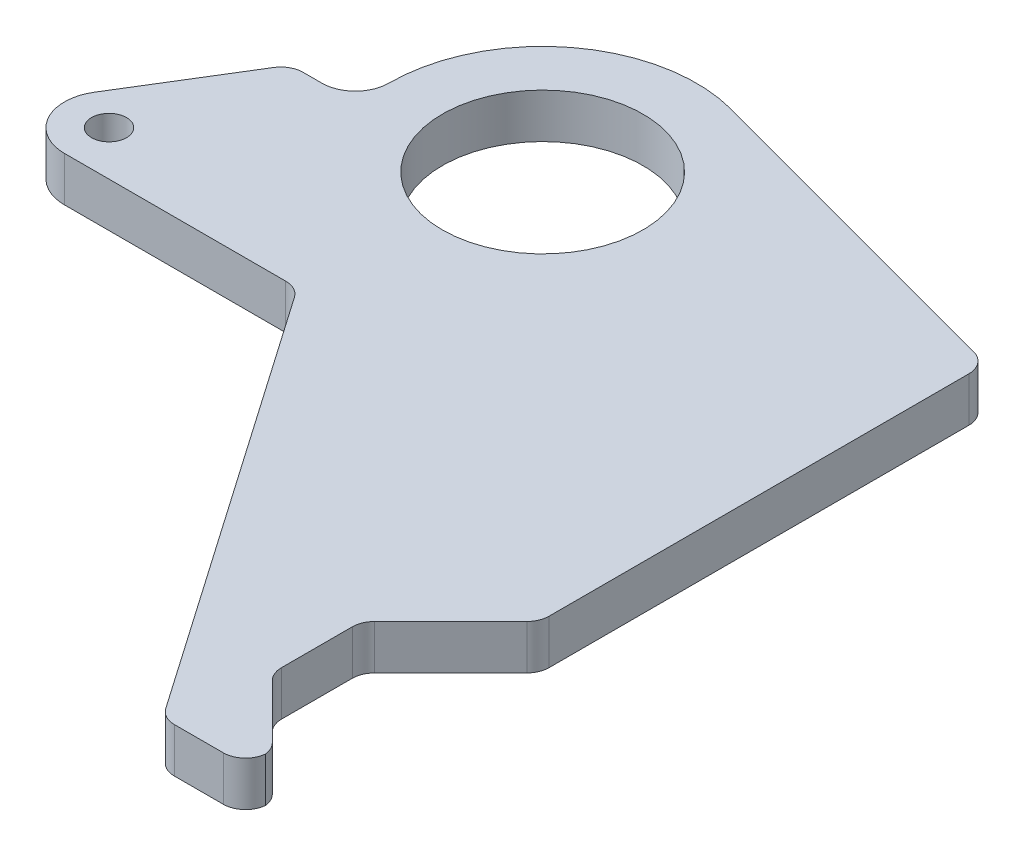
ISO-10303-21;
HEADER;
FILE_DESCRIPTION(('STEP AP214'),'2;1');
FILE_NAME('part.step','',(''),(''),'','','');
FILE_SCHEMA(('AUTOMOTIVE_DESIGN { 1 0 10303 214 1 1 1 1 }'));
ENDSEC;
DATA;
#1=APPLICATION_CONTEXT('core data for automotive mechanical design processes');
#2=APPLICATION_PROTOCOL_DEFINITION('international standard','automotive_design',2000,#1);
#3=PRODUCT_CONTEXT('',#1,'mechanical');
#4=PRODUCT('Part','Part','',(#3));
#5=PRODUCT_RELATED_PRODUCT_CATEGORY('part','',(#4));
#6=PRODUCT_DEFINITION_FORMATION('','',#4);
#7=PRODUCT_DEFINITION_CONTEXT('part definition',#1,'design');
#8=PRODUCT_DEFINITION('design','',#6,#7);
#9=PRODUCT_DEFINITION_SHAPE('','',#8);
#10=(LENGTH_UNIT() NAMED_UNIT(*) SI_UNIT(.MILLI.,.METRE.));
#11=(NAMED_UNIT(*) PLANE_ANGLE_UNIT() SI_UNIT($,.RADIAN.));
#12=(NAMED_UNIT(*) SI_UNIT($,.STERADIAN.) SOLID_ANGLE_UNIT());
#13=UNCERTAINTY_MEASURE_WITH_UNIT(LENGTH_MEASURE(1.E-05),#10,'distance_accuracy_value','');
#14=(GEOMETRIC_REPRESENTATION_CONTEXT(3) GLOBAL_UNCERTAINTY_ASSIGNED_CONTEXT((#13)) GLOBAL_UNIT_ASSIGNED_CONTEXT((#10,
#11,#12)) REPRESENTATION_CONTEXT('',''));
#15=CARTESIAN_POINT('',(0.,0.,0.));
#16=DIRECTION('',(0.,0.,1.));
#17=DIRECTION('',(1.,0.,0.));
#18=AXIS2_PLACEMENT_3D('',#15,#16,#17);
#19=CARTESIAN_POINT('',(85.7249999999999,6.35,-50.8));
#20=DIRECTION('',(0.,1.,0.));
#21=DIRECTION('',(0.,0.,1.));
#22=AXIS2_PLACEMENT_3D('',#19,#20,#21);
#23=PLANE('',#22);
#24=CARTESIAN_POINT('',(49.3832903514734,6.35,-25.4));
#25=DIRECTION('',(0.,1.,0.));
#26=DIRECTION('',(0.,0.,1.));
#27=AXIS2_PLACEMENT_3D('',#24,#25,#26);
#28=CIRCLE('',#27,2.4892);
#29=CARTESIAN_POINT('',(49.3832903514734,6.35,-22.9108));
#30=VERTEX_POINT('',#29);
#31=EDGE_CURVE('E346',#30,#30,#28,.T.);
#32=ORIENTED_EDGE('',*,*,#31,.F.);
#33=EDGE_LOOP('',(#32));
#34=FACE_BOUND('',#33,.T.);
#35=DIRECTION('',(0.570126882379891,0.,0.821556655373071));
#36=VECTOR('',#35,1.);
#37=CARTESIAN_POINT('',(125.993668437348,6.35,43.552617139428));
#38=LINE('',#37,#36);
#39=CARTESIAN_POINT('',(83.4971483732478,6.35,-17.6851528515562));
#40=VERTEX_POINT('',#39);
#41=CARTESIAN_POINT('',(125.0465200641,6.35,42.1877699909842));
#42=VERTEX_POINT('',#41);
#43=EDGE_CURVE('E318',#40,#42,#38,.T.);
#44=ORIENTED_EDGE('',*,*,#43,.T.);
#45=CARTESIAN_POINT('',(127.65496244491,6.35,40.377617139428));
#46=DIRECTION('',(0.,1.,0.));
#47=DIRECTION('',(0.,0.,1.));
#48=AXIS2_PLACEMENT_3D('',#45,#46,#47);
#49=CIRCLE('',#48,3.175);
#50=CARTESIAN_POINT('',(127.65496244491,6.35,43.552617139428));
#51=VERTEX_POINT('',#50);
#52=EDGE_CURVE('E253',#42,#51,#49,.T.);
#53=ORIENTED_EDGE('',*,*,#52,.T.);
#54=DIRECTION('',(1.,0.,0.));
#55=VECTOR('',#54,1.);
#56=CARTESIAN_POINT('',(125.993668437348,6.35,43.552617139428));
#57=LINE('',#56,#55);
#58=CARTESIAN_POINT('',(134.601626837348,6.35,43.552617139428));
#59=VERTEX_POINT('',#58);
#60=EDGE_CURVE('E324',#51,#59,#57,.T.);
#61=ORIENTED_EDGE('',*,*,#60,.T.);
#62=CARTESIAN_POINT('',(134.601626837348,6.35,40.377617139428));
#63=DIRECTION('',(0.,1.,0.));
#64=DIRECTION('',(0.,0.,1.));
#65=AXIS2_PLACEMENT_3D('',#62,#63,#64);
#66=CIRCLE('',#65,3.175);
#67=CARTESIAN_POINT('',(137.758362723563,6.35,40.7176811696953));
#68=VERTEX_POINT('',#67);
#69=EDGE_CURVE('E59',#59,#68,#66,.T.);
#70=ORIENTED_EDGE('',*,*,#69,.T.);
#71=CARTESIAN_POINT('',(134.601626837348,6.35,41.0577451999626));
#72=DIRECTION('',(0.,1.,0.));
#73=DIRECTION('',(0.,0.,1.));
#74=AXIS2_PLACEMENT_3D('',#71,#72,#73);
#75=CIRCLE('',#74,3.175);
#76=CARTESIAN_POINT('',(136.846690867615,6.35,38.8126811696953));
#77=VERTEX_POINT('',#76);
#78=EDGE_CURVE('E250',#68,#77,#75,.T.);
#79=ORIENTED_EDGE('',*,*,#78,.T.);
#80=DIRECTION('',(-0.707106781186547,0.,-0.707106781186548));
#81=VECTOR('',#80,1.);
#82=CARTESIAN_POINT('',(128.251626837348,6.35,30.217617139428));
#83=LINE('',#82,#81);
#84=CARTESIAN_POINT('',(129.181562807081,6.35,31.1475531091607));
#85=VERTEX_POINT('',#84);
#86=EDGE_CURVE('E326',#77,#85,#83,.T.);
#87=ORIENTED_EDGE('',*,*,#86,.T.);
#88=CARTESIAN_POINT('',(131.426626837348,6.35,28.9024890788934));
#89=DIRECTION('',(0.,1.,0.));
#90=DIRECTION('',(0.,0.,1.));
#91=AXIS2_PLACEMENT_3D('',#88,#89,#90);
#92=CIRCLE('',#91,3.175);
#93=CARTESIAN_POINT('',(128.251626837348,6.35,28.9024890788935));
#94=VERTEX_POINT('',#93);
#95=EDGE_CURVE('E286',#85,#94,#92,.F.);
#96=ORIENTED_EDGE('',*,*,#95,.T.);
#97=DIRECTION('',(0.,0.,-1.));
#98=VECTOR('',#97,1.);
#99=CARTESIAN_POINT('',(128.251626837348,6.35,17.517617139428));
#100=LINE('',#99,#98);
#101=CARTESIAN_POINT('',(128.251626837348,6.35,18.8327451999626));
#102=VERTEX_POINT('',#101);
#103=EDGE_CURVE('E334',#94,#102,#100,.T.);
#104=ORIENTED_EDGE('',*,*,#103,.T.);
#105=CARTESIAN_POINT('',(131.426626837348,6.35,18.8327451999626));
#106=DIRECTION('',(0.,1.,0.));
#107=DIRECTION('',(0.,0.,1.));
#108=AXIS2_PLACEMENT_3D('',#105,#106,#107);
#109=CIRCLE('',#108,3.175);
#110=CARTESIAN_POINT('',(129.181562807081,6.35,16.5876811696953));
#111=VERTEX_POINT('',#110);
#112=EDGE_CURVE('E290',#102,#111,#109,.F.);
#113=ORIENTED_EDGE('',*,*,#112,.T.);
#114=DIRECTION('',(0.707106781186549,0.,-0.707106781186546));
#115=VECTOR('',#114,1.);
#116=CARTESIAN_POINT('',(140.951626837348,6.35,4.81761713942811));
#117=LINE('',#116,#115);
#118=CARTESIAN_POINT('',(140.021690867615,6.35,5.74755310916084));
#119=VERTEX_POINT('',#118);
#120=EDGE_CURVE('E337',#111,#119,#117,.T.);
#121=ORIENTED_EDGE('',*,*,#120,.T.);
#122=CARTESIAN_POINT('',(137.776626837348,6.35,3.50248907889355));
#123=DIRECTION('',(0.,1.,0.));
#124=DIRECTION('',(0.,0.,1.));
#125=AXIS2_PLACEMENT_3D('',#122,#123,#124);
#126=CIRCLE('',#125,3.175);
#127=CARTESIAN_POINT('',(140.951626837348,6.35,3.50248907889355));
#128=VERTEX_POINT('',#127);
#129=EDGE_CURVE('E247',#119,#128,#126,.T.);
#130=ORIENTED_EDGE('',*,*,#129,.T.);
#131=DIRECTION('',(0.,0.,-1.));
#132=VECTOR('',#131,1.);
#133=CARTESIAN_POINT('',(140.951626837348,6.35,-58.6823828605719));
#134=LINE('',#133,#132);
#135=CARTESIAN_POINT('',(140.951626837348,6.35,-56.2461196737387));
#136=VERTEX_POINT('',#135);
#137=EDGE_CURVE('E340',#128,#136,#134,.T.);
#138=ORIENTED_EDGE('',*,*,#137,.T.);
#139=CARTESIAN_POINT('',(137.776626837348,6.35,-56.2461196737387));
#140=DIRECTION('',(0.,1.,0.));
#141=DIRECTION('',(0.,0.,1.));
#142=AXIS2_PLACEMENT_3D('',#139,#140,#141);
#143=CIRCLE('',#142,3.175);
#144=CARTESIAN_POINT('',(138.598377305548,6.35,-59.3129341722065));
#145=VERTEX_POINT('',#144);
#146=EDGE_CURVE('E66',#136,#145,#143,.T.);
#147=ORIENTED_EDGE('',*,*,#146,.T.);
#148=DIRECTION('',(-0.96592582628907,0.,-0.258819045102515));
#149=VECTOR('',#148,1.);
#150=CARTESIAN_POINT('',(91.3950782305833,6.35,-71.9610200394278));
#151=LINE('',#150,#149);
#152=CARTESIAN_POINT('',(91.3950782305833,6.35,-71.9610200394278));
#153=VERTEX_POINT('',#152);
#154=EDGE_CURVE('E208',#145,#153,#151,.T.);
#155=ORIENTED_EDGE('',*,*,#154,.T.);
#156=CARTESIAN_POINT('',(85.7249999999999,6.35,-50.8));
#157=DIRECTION('',(0.,1.,0.));
#158=DIRECTION('',(0.,0.,1.));
#159=AXIS2_PLACEMENT_3D('',#156,#157,#158);
#160=CIRCLE('',#159,21.9075);
#161=CARTESIAN_POINT('',(63.8174999999999,6.35,-50.8));
#162=VERTEX_POINT('',#161);
#163=EDGE_CURVE('E203',#153,#162,#160,.T.);
#164=ORIENTED_EDGE('',*,*,#163,.T.);
#165=CARTESIAN_POINT('',(59.0549999999999,6.35,-50.8));
#166=DIRECTION('',(0.,-1.,0.));
#167=DIRECTION('',(0.,0.,1.));
#168=AXIS2_PLACEMENT_3D('',#165,#166,#167);
#169=CIRCLE('',#168,4.76250000000001);
#170=CARTESIAN_POINT('',(59.0549999999999,6.35,-46.0375));
#171=VERTEX_POINT('',#170);
#172=EDGE_CURVE('E192',#162,#171,#169,.T.);
#173=ORIENTED_EDGE('',*,*,#172,.T.);
#174=DIRECTION('',(-1.,0.,0.));
#175=VECTOR('',#174,1.);
#176=CARTESIAN_POINT('',(54.6099999999999,6.35,-46.0375));
#177=LINE('',#176,#175);
#178=CARTESIAN_POINT('',(56.3856812178204,6.35,-46.0375));
#179=VERTEX_POINT('',#178);
#180=EDGE_CURVE('E202',#171,#179,#177,.T.);
#181=ORIENTED_EDGE('',*,*,#180,.T.);
#182=CARTESIAN_POINT('',(56.3856812178203,6.35,-42.8625));
#183=DIRECTION('',(0.,1.,0.));
#184=DIRECTION('',(0.,0.,1.));
#185=AXIS2_PLACEMENT_3D('',#182,#183,#184);
#186=CIRCLE('',#185,3.175);
#187=CARTESIAN_POINT('',(53.680463675495,6.35,-44.5245538645589));
#188=VERTEX_POINT('',#187);
#189=EDGE_CURVE('E245',#179,#188,#186,.T.);
#190=ORIENTED_EDGE('',*,*,#189,.T.);
#191=DIRECTION('',(-0.523481532144545,0.,0.85203702120483));
#192=VECTOR('',#191,1.);
#193=CARTESIAN_POINT('',(43.9728552668228,6.35,-28.7241077291179));
#194=LINE('',#193,#192);
#195=CARTESIAN_POINT('',(43.9728552668228,6.35,-28.7241077291179));
#196=VERTEX_POINT('',#195);
#197=EDGE_CURVE('E383',#188,#196,#194,.T.);
#198=ORIENTED_EDGE('',*,*,#197,.T.);
#199=CARTESIAN_POINT('',(49.3832903514734,6.35,-25.4));
#200=DIRECTION('',(0.,1.,0.));
#201=DIRECTION('',(0.,0.,1.));
#202=AXIS2_PLACEMENT_3D('',#199,#200,#201);
#203=CIRCLE('',#202,6.35000000000001);
#204=CARTESIAN_POINT('',(49.3832903514734,6.35,-19.05));
#205=VERTEX_POINT('',#204);
#206=EDGE_CURVE('E328',#196,#205,#203,.T.);
#207=ORIENTED_EDGE('',*,*,#206,.T.);
#208=DIRECTION('',(1.,0.,0.));
#209=VECTOR('',#208,1.);
#210=CARTESIAN_POINT('',(82.5500000000002,6.35,-19.05));
#211=LINE('',#210,#209);
#212=CARTESIAN_POINT('',(80.8887059924383,6.35,-19.05));
#213=VERTEX_POINT('',#212);
#214=EDGE_CURVE('E320',#205,#213,#211,.T.);
#215=ORIENTED_EDGE('',*,*,#214,.T.);
#216=CARTESIAN_POINT('',(80.8887059924383,6.35,-15.875));
#217=DIRECTION('',(0.,1.,0.));
#218=DIRECTION('',(0.,0.,1.));
#219=AXIS2_PLACEMENT_3D('',#216,#217,#218);
#220=CIRCLE('',#219,3.175);
#221=EDGE_CURVE('E11',#213,#40,#220,.F.);
#222=ORIENTED_EDGE('',*,*,#221,.T.);
#223=EDGE_LOOP('',(#44,#53,#61,#70,#79,#87,#96,#104,#113,#121,#130,#138,#147,#155,#164,#173,
#181,#190,#198,#207,#215,#222));
#224=FACE_BOUND('',#223,.T.);
#225=CARTESIAN_POINT('',(85.7249999999999,6.35,-50.8));
#226=DIRECTION('',(0.,1.,0.));
#227=DIRECTION('',(0.,0.,1.));
#228=AXIS2_PLACEMENT_3D('',#225,#226,#227);
#229=CIRCLE('',#228,14.2875);
#230=CARTESIAN_POINT('',(85.7249999999999,6.35,-36.5125));
#231=VERTEX_POINT('',#230);
#232=EDGE_CURVE('E395',#231,#231,#229,.T.);
#233=ORIENTED_EDGE('',*,*,#232,.F.);
#234=EDGE_LOOP('',(#233));
#235=FACE_BOUND('',#234,.T.);
#236=ADVANCED_FACE('F43',(#34,#224,#235),#23,.T.);
#237=CARTESIAN_POINT('',(85.7249999999999,0.,-50.8));
#238=DIRECTION('',(0.,1.,0.));
#239=DIRECTION('',(0.,0.,1.));
#240=AXIS2_PLACEMENT_3D('',#237,#238,#239);
#241=PLANE('',#240);
#242=DIRECTION('',(1.,0.,0.));
#243=VECTOR('',#242,1.);
#244=CARTESIAN_POINT('',(125.993668437348,0.,43.552617139428));
#245=LINE('',#244,#243);
#246=CARTESIAN_POINT('',(127.65496244491,0.,43.552617139428));
#247=VERTEX_POINT('',#246);
#248=CARTESIAN_POINT('',(134.601626837348,0.,43.552617139428));
#249=VERTEX_POINT('',#248);
#250=EDGE_CURVE('E355',#247,#249,#245,.T.);
#251=ORIENTED_EDGE('',*,*,#250,.F.);
#252=CARTESIAN_POINT('',(127.65496244491,0.,40.377617139428));
#253=DIRECTION('',(0.,1.,0.));
#254=DIRECTION('',(0.,0.,1.));
#255=AXIS2_PLACEMENT_3D('',#252,#253,#254);
#256=CIRCLE('',#255,3.175);
#257=CARTESIAN_POINT('',(125.0465200641,0.,42.1877699909842));
#258=VERTEX_POINT('',#257);
#259=EDGE_CURVE('E238',#247,#258,#256,.F.);
#260=ORIENTED_EDGE('',*,*,#259,.T.);
#261=DIRECTION('',(0.570126882379891,0.,0.821556655373071));
#262=VECTOR('',#261,1.);
#263=CARTESIAN_POINT('',(125.993668437348,0.,43.552617139428));
#264=LINE('',#263,#262);
#265=CARTESIAN_POINT('',(83.4971483732478,0.,-17.6851528515562));
#266=VERTEX_POINT('',#265);
#267=EDGE_CURVE('E302',#266,#258,#264,.T.);
#268=ORIENTED_EDGE('',*,*,#267,.F.);
#269=CARTESIAN_POINT('',(80.8887059924383,0.,-15.875));
#270=DIRECTION('',(0.,1.,0.));
#271=DIRECTION('',(0.,0.,1.));
#272=AXIS2_PLACEMENT_3D('',#269,#270,#271);
#273=CIRCLE('',#272,3.175);
#274=CARTESIAN_POINT('',(80.8887059924383,0.,-19.05));
#275=VERTEX_POINT('',#274);
#276=EDGE_CURVE('E52',#266,#275,#273,.T.);
#277=ORIENTED_EDGE('',*,*,#276,.T.);
#278=DIRECTION('',(1.,0.,0.));
#279=VECTOR('',#278,1.);
#280=CARTESIAN_POINT('',(82.5500000000002,0.,-19.05));
#281=LINE('',#280,#279);
#282=CARTESIAN_POINT('',(49.3832903514734,0.,-19.05));
#283=VERTEX_POINT('',#282);
#284=EDGE_CURVE('E300',#283,#275,#281,.T.);
#285=ORIENTED_EDGE('',*,*,#284,.F.);
#286=CARTESIAN_POINT('',(49.3832903514734,0.,-25.4));
#287=DIRECTION('',(0.,1.,0.));
#288=DIRECTION('',(0.,0.,1.));
#289=AXIS2_PLACEMENT_3D('',#286,#287,#288);
#290=CIRCLE('',#289,6.35000000000001);
#291=CARTESIAN_POINT('',(43.9728552668228,0.,-28.7241077291179));
#292=VERTEX_POINT('',#291);
#293=EDGE_CURVE('E313',#292,#283,#290,.T.);
#294=ORIENTED_EDGE('',*,*,#293,.F.);
#295=DIRECTION('',(-0.523481532144545,0.,0.85203702120483));
#296=VECTOR('',#295,1.);
#297=CARTESIAN_POINT('',(43.9728552668228,0.,-28.7241077291179));
#298=LINE('',#297,#296);
#299=CARTESIAN_POINT('',(53.680463675495,0.,-44.5245538645589));
#300=VERTEX_POINT('',#299);
#301=EDGE_CURVE('E351',#300,#292,#298,.T.);
#302=ORIENTED_EDGE('',*,*,#301,.F.);
#303=CARTESIAN_POINT('',(56.3856812178203,0.,-42.8625));
#304=DIRECTION('',(0.,1.,0.));
#305=DIRECTION('',(0.,0.,1.));
#306=AXIS2_PLACEMENT_3D('',#303,#304,#305);
#307=CIRCLE('',#306,3.175);
#308=CARTESIAN_POINT('',(56.3856812178204,0.,-46.0375));
#309=VERTEX_POINT('',#308);
#310=EDGE_CURVE('E228',#300,#309,#307,.F.);
#311=ORIENTED_EDGE('',*,*,#310,.T.);
#312=DIRECTION('',(-1.,0.,0.));
#313=VECTOR('',#312,1.);
#314=CARTESIAN_POINT('',(54.6099999999999,0.,-46.0375));
#315=LINE('',#314,#313);
#316=CARTESIAN_POINT('',(59.0549999999999,0.,-46.0375));
#317=VERTEX_POINT('',#316);
#318=EDGE_CURVE('E348',#317,#309,#315,.T.);
#319=ORIENTED_EDGE('',*,*,#318,.F.);
#320=CARTESIAN_POINT('',(59.0549999999999,0.,-50.8));
#321=DIRECTION('',(0.,-1.,0.));
#322=DIRECTION('',(0.,0.,1.));
#323=AXIS2_PLACEMENT_3D('',#320,#321,#322);
#324=CIRCLE('',#323,4.76250000000001);
#325=CARTESIAN_POINT('',(63.8174999999999,0.,-50.8));
#326=VERTEX_POINT('',#325);
#327=EDGE_CURVE('E345',#326,#317,#324,.T.);
#328=ORIENTED_EDGE('',*,*,#327,.F.);
#329=CARTESIAN_POINT('',(85.7249999999999,0.,-50.8));
#330=DIRECTION('',(0.,1.,0.));
#331=DIRECTION('',(0.,0.,1.));
#332=AXIS2_PLACEMENT_3D('',#329,#330,#331);
#333=CIRCLE('',#332,21.9075);
#334=CARTESIAN_POINT('',(91.3950782305833,0.,-71.9610200394278));
#335=VERTEX_POINT('',#334);
#336=EDGE_CURVE('E216',#335,#326,#333,.T.);
#337=ORIENTED_EDGE('',*,*,#336,.F.);
#338=DIRECTION('',(-0.96592582628907,0.,-0.258819045102515));
#339=VECTOR('',#338,1.);
#340=CARTESIAN_POINT('',(91.3950782305833,0.,-71.9610200394278));
#341=LINE('',#340,#339);
#342=CARTESIAN_POINT('',(138.598377305548,0.,-59.3129341722065));
#343=VERTEX_POINT('',#342);
#344=EDGE_CURVE('E212',#343,#335,#341,.T.);
#345=ORIENTED_EDGE('',*,*,#344,.F.);
#346=CARTESIAN_POINT('',(137.776626837348,0.,-56.2461196737387));
#347=DIRECTION('',(0.,1.,0.));
#348=DIRECTION('',(0.,0.,1.));
#349=AXIS2_PLACEMENT_3D('',#346,#347,#348);
#350=CIRCLE('',#349,3.175);
#351=CARTESIAN_POINT('',(140.951626837348,0.,-56.2461196737387));
#352=VERTEX_POINT('',#351);
#353=EDGE_CURVE('E232',#343,#352,#350,.F.);
#354=ORIENTED_EDGE('',*,*,#353,.T.);
#355=DIRECTION('',(0.,0.,-1.));
#356=VECTOR('',#355,1.);
#357=CARTESIAN_POINT('',(140.951626837348,0.,-58.6823828605719));
#358=LINE('',#357,#356);
#359=CARTESIAN_POINT('',(140.951626837348,0.,3.50248907889355));
#360=VERTEX_POINT('',#359);
#361=EDGE_CURVE('E367',#360,#352,#358,.T.);
#362=ORIENTED_EDGE('',*,*,#361,.F.);
#363=CARTESIAN_POINT('',(137.776626837348,0.,3.50248907889355));
#364=DIRECTION('',(0.,1.,0.));
#365=DIRECTION('',(0.,0.,1.));
#366=AXIS2_PLACEMENT_3D('',#363,#364,#365);
#367=CIRCLE('',#366,3.175);
#368=CARTESIAN_POINT('',(140.021690867615,0.,5.74755310916084));
#369=VERTEX_POINT('',#368);
#370=EDGE_CURVE('E230',#360,#369,#367,.F.);
#371=ORIENTED_EDGE('',*,*,#370,.T.);
#372=DIRECTION('',(0.707106781186549,0.,-0.707106781186546));
#373=VECTOR('',#372,1.);
#374=CARTESIAN_POINT('',(140.951626837348,0.,4.81761713942811));
#375=LINE('',#374,#373);
#376=CARTESIAN_POINT('',(129.181562807081,0.,16.5876811696953));
#377=VERTEX_POINT('',#376);
#378=EDGE_CURVE('E364',#377,#369,#375,.T.);
#379=ORIENTED_EDGE('',*,*,#378,.F.);
#380=CARTESIAN_POINT('',(131.426626837348,0.,18.8327451999626));
#381=DIRECTION('',(0.,1.,0.));
#382=DIRECTION('',(0.,0.,1.));
#383=AXIS2_PLACEMENT_3D('',#380,#381,#382);
#384=CIRCLE('',#383,3.175);
#385=CARTESIAN_POINT('',(128.251626837348,0.,18.8327451999626));
#386=VERTEX_POINT('',#385);
#387=EDGE_CURVE('E288',#377,#386,#384,.T.);
#388=ORIENTED_EDGE('',*,*,#387,.T.);
#389=DIRECTION('',(0.,0.,-1.));
#390=VECTOR('',#389,1.);
#391=CARTESIAN_POINT('',(128.251626837348,0.,17.517617139428));
#392=LINE('',#391,#390);
#393=CARTESIAN_POINT('',(128.251626837348,0.,28.9024890788935));
#394=VERTEX_POINT('',#393);
#395=EDGE_CURVE('E361',#394,#386,#392,.T.);
#396=ORIENTED_EDGE('',*,*,#395,.F.);
#397=CARTESIAN_POINT('',(131.426626837348,0.,28.9024890788934));
#398=DIRECTION('',(0.,1.,0.));
#399=DIRECTION('',(0.,0.,1.));
#400=AXIS2_PLACEMENT_3D('',#397,#398,#399);
#401=CIRCLE('',#400,3.175);
#402=CARTESIAN_POINT('',(129.181562807081,0.,31.1475531091607));
#403=VERTEX_POINT('',#402);
#404=EDGE_CURVE('E284',#394,#403,#401,.T.);
#405=ORIENTED_EDGE('',*,*,#404,.T.);
#406=DIRECTION('',(-0.707106781186547,0.,-0.707106781186548));
#407=VECTOR('',#406,1.);
#408=CARTESIAN_POINT('',(128.251626837348,0.,30.217617139428));
#409=LINE('',#408,#407);
#410=CARTESIAN_POINT('',(136.846690867615,0.,38.8126811696953));
#411=VERTEX_POINT('',#410);
#412=EDGE_CURVE('E358',#411,#403,#409,.T.);
#413=ORIENTED_EDGE('',*,*,#412,.F.);
#414=CARTESIAN_POINT('',(134.601626837348,0.,41.0577451999626));
#415=DIRECTION('',(0.,1.,0.));
#416=DIRECTION('',(0.,0.,1.));
#417=AXIS2_PLACEMENT_3D('',#414,#415,#416);
#418=CIRCLE('',#417,3.175);
#419=CARTESIAN_POINT('',(137.758362723563,0.,40.7176811696953));
#420=VERTEX_POINT('',#419);
#421=EDGE_CURVE('E234',#411,#420,#418,.F.);
#422=ORIENTED_EDGE('',*,*,#421,.T.);
#423=CARTESIAN_POINT('',(134.601626837348,0.,40.377617139428));
#424=DIRECTION('',(0.,1.,0.));
#425=DIRECTION('',(0.,0.,1.));
#426=AXIS2_PLACEMENT_3D('',#423,#424,#425);
#427=CIRCLE('',#426,3.175);
#428=EDGE_CURVE('E236',#420,#249,#427,.F.);
#429=ORIENTED_EDGE('',*,*,#428,.T.);
#430=EDGE_LOOP('',(#251,#260,#268,#277,#285,#294,#302,#311,#319,#328,#337,#345,#354,#362,#371,
#379,#388,#396,#405,#413,#422,#429));
#431=FACE_BOUND('',#430,.T.);
#432=CARTESIAN_POINT('',(49.3832903514734,0.,-25.4));
#433=DIRECTION('',(0.,1.,0.));
#434=DIRECTION('',(0.,0.,1.));
#435=AXIS2_PLACEMENT_3D('',#432,#433,#434);
#436=CIRCLE('',#435,2.4892);
#437=CARTESIAN_POINT('',(49.3832903514734,0.,-22.9108));
#438=VERTEX_POINT('',#437);
#439=EDGE_CURVE('E392',#438,#438,#436,.T.);
#440=ORIENTED_EDGE('',*,*,#439,.T.);
#441=EDGE_LOOP('',(#440));
#442=FACE_BOUND('',#441,.T.);
#443=CARTESIAN_POINT('',(85.7249999999999,0.,-50.8));
#444=DIRECTION('',(0.,1.,0.));
#445=DIRECTION('',(0.,0.,1.));
#446=AXIS2_PLACEMENT_3D('',#443,#444,#445);
#447=CIRCLE('',#446,14.2875);
#448=CARTESIAN_POINT('',(85.7249999999999,0.,-36.5125));
#449=VERTEX_POINT('',#448);
#450=EDGE_CURVE('E398',#449,#449,#447,.T.);
#451=ORIENTED_EDGE('',*,*,#450,.T.);
#452=EDGE_LOOP('',(#451));
#453=FACE_BOUND('',#452,.T.);
#454=ADVANCED_FACE('F297',(#431,#442,#453),#241,.F.);
#455=CARTESIAN_POINT('',(85.7249999999999,6.35,-50.8));
#456=DIRECTION('',(0.,-1.,0.));
#457=DIRECTION('',(0.,0.,-1.));
#458=AXIS2_PLACEMENT_3D('',#455,#456,#457);
#459=CYLINDRICAL_SURFACE('',#458,21.9075);
#460=ORIENTED_EDGE('',*,*,#336,.T.);
#461=DIRECTION('',(0.,-1.,0.));
#462=VECTOR('',#461,1.);
#463=CARTESIAN_POINT('',(63.8174999999999,6.35,-50.8));
#464=LINE('',#463,#462);
#465=EDGE_CURVE('E196',#162,#326,#464,.T.);
#466=ORIENTED_EDGE('',*,*,#465,.F.);
#467=ORIENTED_EDGE('',*,*,#163,.F.);
#468=DIRECTION('',(0.,-1.,0.));
#469=VECTOR('',#468,1.);
#470=CARTESIAN_POINT('',(91.3950782305833,6.35,-71.9610200394278));
#471=LINE('',#470,#469);
#472=EDGE_CURVE('E343',#153,#335,#471,.T.);
#473=ORIENTED_EDGE('',*,*,#472,.T.);
#474=EDGE_LOOP('',(#460,#466,#467,#473));
#475=FACE_BOUND('',#474,.T.);
#476=ADVANCED_FACE('F214',(#475),#459,.T.);
#477=CARTESIAN_POINT('',(59.0549999999999,6.35,-50.8));
#478=DIRECTION('',(0.,-1.,0.));
#479=DIRECTION('',(0.,0.,-1.));
#480=AXIS2_PLACEMENT_3D('',#477,#478,#479);
#481=CYLINDRICAL_SURFACE('',#480,4.76250000000001);
#482=ORIENTED_EDGE('',*,*,#327,.T.);
#483=DIRECTION('',(0.,-1.,0.));
#484=VECTOR('',#483,1.);
#485=CARTESIAN_POINT('',(59.0549999999999,6.35,-46.0375));
#486=LINE('',#485,#484);
#487=EDGE_CURVE('E199',#171,#317,#486,.T.);
#488=ORIENTED_EDGE('',*,*,#487,.F.);
#489=ORIENTED_EDGE('',*,*,#172,.F.);
#490=ORIENTED_EDGE('',*,*,#465,.T.);
#491=EDGE_LOOP('',(#482,#488,#489,#490));
#492=FACE_BOUND('',#491,.T.);
#493=ADVANCED_FACE('F194',(#492),#481,.F.);
#494=CARTESIAN_POINT('',(54.6099999999999,6.35,-46.0375));
#495=DIRECTION('',(0.,0.,1.));
#496=DIRECTION('',(1.,0.,0.));
#497=AXIS2_PLACEMENT_3D('',#494,#495,#496);
#498=PLANE('',#497);
#499=ORIENTED_EDGE('',*,*,#318,.T.);
#500=DIRECTION('',(0.,-1.,0.));
#501=VECTOR('',#500,1.);
#502=CARTESIAN_POINT('',(56.3856812178204,6.35,-46.0375));
#503=LINE('',#502,#501);
#504=EDGE_CURVE('E282',#309,#179,#503,.F.);
#505=ORIENTED_EDGE('',*,*,#504,.T.);
#506=ORIENTED_EDGE('',*,*,#180,.F.);
#507=ORIENTED_EDGE('',*,*,#487,.T.);
#508=EDGE_LOOP('',(#499,#505,#506,#507));
#509=FACE_BOUND('',#508,.T.);
#510=ADVANCED_FACE('F388',(#509),#498,.F.);
#511=CARTESIAN_POINT('',(43.9728552668228,6.35,-28.7241077291179));
#512=DIRECTION('',(0.85203702120483,0.,0.523481532144545));
#513=DIRECTION('',(0.523481532144545,0.,-0.85203702120483));
#514=AXIS2_PLACEMENT_3D('',#511,#512,#513);
#515=PLANE('',#514);
#516=ORIENTED_EDGE('',*,*,#197,.F.);
#517=DIRECTION('',(0.,-1.,0.));
#518=VECTOR('',#517,1.);
#519=CARTESIAN_POINT('',(53.680463675495,6.35,-44.5245538645589));
#520=LINE('',#519,#518);
#521=EDGE_CURVE('E279',#188,#300,#520,.T.);
#522=ORIENTED_EDGE('',*,*,#521,.T.);
#523=ORIENTED_EDGE('',*,*,#301,.T.);
#524=DIRECTION('',(0.,-1.,0.));
#525=VECTOR('',#524,1.);
#526=CARTESIAN_POINT('',(43.9728552668228,6.35,-28.7241077291179));
#527=LINE('',#526,#525);
#528=EDGE_CURVE('E222',#196,#292,#527,.T.);
#529=ORIENTED_EDGE('',*,*,#528,.F.);
#530=EDGE_LOOP('',(#516,#522,#523,#529));
#531=FACE_BOUND('',#530,.T.);
#532=ADVANCED_FACE('F381',(#531),#515,.F.);
#533=CARTESIAN_POINT('',(49.3832903514734,6.35,-25.4));
#534=DIRECTION('',(0.,-1.,0.));
#535=DIRECTION('',(0.,0.,-1.));
#536=AXIS2_PLACEMENT_3D('',#533,#534,#535);
#537=CYLINDRICAL_SURFACE('',#536,6.35000000000001);
#538=ORIENTED_EDGE('',*,*,#293,.T.);
#539=DIRECTION('',(0.,-1.,0.));
#540=VECTOR('',#539,1.);
#541=CARTESIAN_POINT('',(49.3832903514734,6.35,-19.05));
#542=LINE('',#541,#540);
#543=EDGE_CURVE('E312',#205,#283,#542,.T.);
#544=ORIENTED_EDGE('',*,*,#543,.F.);
#545=ORIENTED_EDGE('',*,*,#206,.F.);
#546=ORIENTED_EDGE('',*,*,#528,.T.);
#547=EDGE_LOOP('',(#538,#544,#545,#546));
#548=FACE_BOUND('',#547,.T.);
#549=ADVANCED_FACE('F376',(#548),#537,.T.);
#550=CARTESIAN_POINT('',(82.5500000000002,6.35,-19.05));
#551=DIRECTION('',(0.,0.,-1.));
#552=DIRECTION('',(-1.,0.,0.));
#553=AXIS2_PLACEMENT_3D('',#550,#551,#552);
#554=PLANE('',#553);
#555=ORIENTED_EDGE('',*,*,#284,.T.);
#556=DIRECTION('',(0.,-1.,0.));
#557=VECTOR('',#556,1.);
#558=CARTESIAN_POINT('',(80.8887059924383,6.35,-19.05));
#559=LINE('',#558,#557);
#560=EDGE_CURVE('E277',#275,#213,#559,.F.);
#561=ORIENTED_EDGE('',*,*,#560,.T.);
#562=ORIENTED_EDGE('',*,*,#214,.F.);
#563=ORIENTED_EDGE('',*,*,#543,.T.);
#564=EDGE_LOOP('',(#555,#561,#562,#563));
#565=FACE_BOUND('',#564,.T.);
#566=ADVANCED_FACE('F308',(#565),#554,.F.);
#567=CARTESIAN_POINT('',(125.993668437348,6.35,43.552617139428));
#568=DIRECTION('',(0.82155665537307,0.,-0.570126882379891));
#569=DIRECTION('',(-0.570126882379891,0.,-0.821556655373071));
#570=AXIS2_PLACEMENT_3D('',#567,#568,#569);
#571=PLANE('',#570);
#572=ORIENTED_EDGE('',*,*,#267,.T.);
#573=DIRECTION('',(0.,-1.,0.));
#574=VECTOR('',#573,1.);
#575=CARTESIAN_POINT('',(125.0465200641,6.35,42.1877699909842));
#576=LINE('',#575,#574);
#577=EDGE_CURVE('E243',#258,#42,#576,.F.);
#578=ORIENTED_EDGE('',*,*,#577,.T.);
#579=ORIENTED_EDGE('',*,*,#43,.F.);
#580=DIRECTION('',(0.,-1.,0.));
#581=VECTOR('',#580,1.);
#582=CARTESIAN_POINT('',(83.4971483732478,0.,-17.6851528515561));
#583=LINE('',#582,#581);
#584=EDGE_CURVE('E240',#40,#266,#583,.T.);
#585=ORIENTED_EDGE('',*,*,#584,.T.);
#586=EDGE_LOOP('',(#572,#578,#579,#585));
#587=FACE_BOUND('',#586,.T.);
#588=ADVANCED_FACE('F322',(#587),#571,.F.);
#589=CARTESIAN_POINT('',(125.993668437348,6.35,43.552617139428));
#590=DIRECTION('',(0.,0.,-1.));
#591=DIRECTION('',(-1.,0.,0.));
#592=AXIS2_PLACEMENT_3D('',#589,#590,#591);
#593=PLANE('',#592);
#594=ORIENTED_EDGE('',*,*,#60,.F.);
#595=DIRECTION('',(0.,-1.,0.));
#596=VECTOR('',#595,1.);
#597=CARTESIAN_POINT('',(127.65496244491,6.35,43.552617139428));
#598=LINE('',#597,#596);
#599=EDGE_CURVE('E220',#51,#247,#598,.T.);
#600=ORIENTED_EDGE('',*,*,#599,.T.);
#601=ORIENTED_EDGE('',*,*,#250,.T.);
#602=DIRECTION('',(0.,-1.,0.));
#603=VECTOR('',#602,1.);
#604=CARTESIAN_POINT('',(134.601626837348,6.35,43.552617139428));
#605=LINE('',#604,#603);
#606=EDGE_CURVE('E217',#249,#59,#605,.F.);
#607=ORIENTED_EDGE('',*,*,#606,.T.);
#608=EDGE_LOOP('',(#594,#600,#601,#607));
#609=FACE_BOUND('',#608,.T.);
#610=ADVANCED_FACE('F438',(#609),#593,.F.);
#611=CARTESIAN_POINT('',(128.251626837348,6.35,30.217617139428));
#612=DIRECTION('',(-0.707106781186548,0.,0.707106781186547));
#613=DIRECTION('',(0.707106781186547,0.,0.707106781186548));
#614=AXIS2_PLACEMENT_3D('',#611,#612,#613);
#615=PLANE('',#614);
#616=ORIENTED_EDGE('',*,*,#86,.F.);
#617=DIRECTION('',(0.,-1.,0.));
#618=VECTOR('',#617,1.);
#619=CARTESIAN_POINT('',(136.846690867615,6.35,38.8126811696953));
#620=LINE('',#619,#618);
#621=EDGE_CURVE('E257',#77,#411,#620,.T.);
#622=ORIENTED_EDGE('',*,*,#621,.T.);
#623=ORIENTED_EDGE('',*,*,#412,.T.);
#624=DIRECTION('',(0.,-1.,0.));
#625=VECTOR('',#624,1.);
#626=CARTESIAN_POINT('',(129.181562807081,6.35,31.1475531091607));
#627=LINE('',#626,#625);
#628=EDGE_CURVE('E255',#403,#85,#627,.F.);
#629=ORIENTED_EDGE('',*,*,#628,.T.);
#630=EDGE_LOOP('',(#616,#622,#623,#629));
#631=FACE_BOUND('',#630,.T.);
#632=ADVANCED_FACE('F434',(#631),#615,.F.);
#633=CARTESIAN_POINT('',(128.251626837348,6.35,17.517617139428));
#634=DIRECTION('',(-1.,0.,0.));
#635=DIRECTION('',(0.,0.,1.));
#636=AXIS2_PLACEMENT_3D('',#633,#634,#635);
#637=PLANE('',#636);
#638=ORIENTED_EDGE('',*,*,#103,.F.);
#639=DIRECTION('',(0.,-1.,0.));
#640=VECTOR('',#639,1.);
#641=CARTESIAN_POINT('',(128.251626837348,0.,28.9024890788935));
#642=LINE('',#641,#640);
#643=EDGE_CURVE('E269',#94,#394,#642,.T.);
#644=ORIENTED_EDGE('',*,*,#643,.T.);
#645=ORIENTED_EDGE('',*,*,#395,.T.);
#646=DIRECTION('',(0.,-1.,0.));
#647=VECTOR('',#646,1.);
#648=CARTESIAN_POINT('',(128.251626837348,6.35,18.8327451999626));
#649=LINE('',#648,#647);
#650=EDGE_CURVE('E267',#386,#102,#649,.F.);
#651=ORIENTED_EDGE('',*,*,#650,.T.);
#652=EDGE_LOOP('',(#638,#644,#645,#651));
#653=FACE_BOUND('',#652,.T.);
#654=ADVANCED_FACE('F430',(#653),#637,.F.);
#655=CARTESIAN_POINT('',(140.951626837348,6.35,4.81761713942811));
#656=DIRECTION('',(-0.707106781186546,0.,-0.707106781186549));
#657=DIRECTION('',(-0.707106781186549,0.,0.707106781186546));
#658=AXIS2_PLACEMENT_3D('',#655,#656,#657);
#659=PLANE('',#658);
#660=ORIENTED_EDGE('',*,*,#120,.F.);
#661=DIRECTION('',(0.,-1.,0.));
#662=VECTOR('',#661,1.);
#663=CARTESIAN_POINT('',(129.181562807081,0.,16.5876811696953));
#664=LINE('',#663,#662);
#665=EDGE_CURVE('E274',#111,#377,#664,.T.);
#666=ORIENTED_EDGE('',*,*,#665,.T.);
#667=ORIENTED_EDGE('',*,*,#378,.T.);
#668=DIRECTION('',(0.,-1.,0.));
#669=VECTOR('',#668,1.);
#670=CARTESIAN_POINT('',(140.021690867615,6.35,5.74755310916084));
#671=LINE('',#670,#669);
#672=EDGE_CURVE('E272',#369,#119,#671,.F.);
#673=ORIENTED_EDGE('',*,*,#672,.T.);
#674=EDGE_LOOP('',(#660,#666,#667,#673));
#675=FACE_BOUND('',#674,.T.);
#676=ADVANCED_FACE('F426',(#675),#659,.F.);
#677=CARTESIAN_POINT('',(140.951626837348,6.35,-58.6823828605719));
#678=DIRECTION('',(-1.,0.,0.));
#679=DIRECTION('',(0.,0.,1.));
#680=AXIS2_PLACEMENT_3D('',#677,#678,#679);
#681=PLANE('',#680);
#682=ORIENTED_EDGE('',*,*,#361,.T.);
#683=DIRECTION('',(0.,-1.,0.));
#684=VECTOR('',#683,1.);
#685=CARTESIAN_POINT('',(140.951626837348,6.35,-56.2461196737387));
#686=LINE('',#685,#684);
#687=EDGE_CURVE('E265',#352,#136,#686,.F.);
#688=ORIENTED_EDGE('',*,*,#687,.T.);
#689=ORIENTED_EDGE('',*,*,#137,.F.);
#690=DIRECTION('',(0.,-1.,0.));
#691=VECTOR('',#690,1.);
#692=CARTESIAN_POINT('',(140.951626837348,6.35,3.50248907889355));
#693=LINE('',#692,#691);
#694=EDGE_CURVE('E262',#128,#360,#693,.T.);
#695=ORIENTED_EDGE('',*,*,#694,.T.);
#696=EDGE_LOOP('',(#682,#688,#689,#695));
#697=FACE_BOUND('',#696,.T.);
#698=ADVANCED_FACE('F422',(#697),#681,.F.);
#699=CARTESIAN_POINT('',(91.3950782305833,6.35,-71.9610200394278));
#700=DIRECTION('',(-0.258819045102515,0.,0.96592582628907));
#701=DIRECTION('',(0.96592582628907,0.,0.258819045102515));
#702=AXIS2_PLACEMENT_3D('',#699,#700,#701);
#703=PLANE('',#702);
#704=ORIENTED_EDGE('',*,*,#154,.F.);
#705=DIRECTION('',(0.,-1.,0.));
#706=VECTOR('',#705,1.);
#707=CARTESIAN_POINT('',(138.598377305548,6.35,-59.3129341722065));
#708=LINE('',#707,#706);
#709=EDGE_CURVE('E259',#145,#343,#708,.T.);
#710=ORIENTED_EDGE('',*,*,#709,.T.);
#711=ORIENTED_EDGE('',*,*,#344,.T.);
#712=ORIENTED_EDGE('',*,*,#472,.F.);
#713=EDGE_LOOP('',(#704,#710,#711,#712));
#714=FACE_BOUND('',#713,.T.);
#715=ADVANCED_FACE('F419',(#714),#703,.F.);
#716=CARTESIAN_POINT('',(49.3832903514734,6.35,-25.4));
#717=DIRECTION('',(0.,-1.,0.));
#718=DIRECTION('',(0.,0.,-1.));
#719=AXIS2_PLACEMENT_3D('',#716,#717,#718);
#720=CYLINDRICAL_SURFACE('',#719,2.4892);
#721=ORIENTED_EDGE('',*,*,#31,.T.);
#722=EDGE_LOOP('',(#721));
#723=FACE_BOUND('',#722,.T.);
#724=ORIENTED_EDGE('',*,*,#439,.F.);
#725=EDGE_LOOP('',(#724));
#726=FACE_BOUND('',#725,.T.);
#727=ADVANCED_FACE('F416',(#723,#726),#720,.F.);
#728=CARTESIAN_POINT('',(85.7249999999999,6.35,-50.8));
#729=DIRECTION('',(0.,-1.,0.));
#730=DIRECTION('',(0.,0.,-1.));
#731=AXIS2_PLACEMENT_3D('',#728,#729,#730);
#732=CYLINDRICAL_SURFACE('',#731,14.2875);
#733=ORIENTED_EDGE('',*,*,#232,.T.);
#734=EDGE_LOOP('',(#733));
#735=FACE_BOUND('',#734,.T.);
#736=ORIENTED_EDGE('',*,*,#450,.F.);
#737=EDGE_LOOP('',(#736));
#738=FACE_BOUND('',#737,.T.);
#739=ADVANCED_FACE('F404',(#735,#738),#732,.F.);
#740=CARTESIAN_POINT('',(127.65496244491,6.35,40.377617139428));
#741=DIRECTION('',(0.,-1.,0.));
#742=DIRECTION('',(0.,0.,-1.));
#743=AXIS2_PLACEMENT_3D('',#740,#741,#742);
#744=CYLINDRICAL_SURFACE('',#743,3.175);
#745=ORIENTED_EDGE('',*,*,#52,.F.);
#746=ORIENTED_EDGE('',*,*,#577,.F.);
#747=ORIENTED_EDGE('',*,*,#259,.F.);
#748=ORIENTED_EDGE('',*,*,#599,.F.);
#749=EDGE_LOOP('',(#745,#746,#747,#748));
#750=FACE_BOUND('',#749,.T.);
#751=ADVANCED_FACE('F457',(#750),#744,.T.);
#752=CARTESIAN_POINT('',(134.601626837348,6.35,41.0577451999626));
#753=DIRECTION('',(0.,-1.,0.));
#754=DIRECTION('',(0.,0.,-1.));
#755=AXIS2_PLACEMENT_3D('',#752,#753,#754);
#756=CYLINDRICAL_SURFACE('',#755,3.175);
#757=ORIENTED_EDGE('',*,*,#621,.F.);
#758=ORIENTED_EDGE('',*,*,#78,.F.);
#759=DIRECTION('',(0.,-1.,0.));
#760=VECTOR('',#759,1.);
#761=CARTESIAN_POINT('',(137.758362723563,3.175,40.7176811696953));
#762=LINE('',#761,#760);
#763=EDGE_CURVE('E47',#420,#68,#762,.F.);
#764=ORIENTED_EDGE('',*,*,#763,.F.);
#765=ORIENTED_EDGE('',*,*,#421,.F.);
#766=EDGE_LOOP('',(#757,#758,#764,#765));
#767=FACE_BOUND('',#766,.T.);
#768=ADVANCED_FACE('F460',(#767),#756,.T.);
#769=CARTESIAN_POINT('',(134.601626837348,6.35,40.377617139428));
#770=DIRECTION('',(0.,-1.,0.));
#771=DIRECTION('',(0.,0.,-1.));
#772=AXIS2_PLACEMENT_3D('',#769,#770,#771);
#773=CYLINDRICAL_SURFACE('',#772,3.175);
#774=ORIENTED_EDGE('',*,*,#69,.F.);
#775=ORIENTED_EDGE('',*,*,#606,.F.);
#776=ORIENTED_EDGE('',*,*,#428,.F.);
#777=ORIENTED_EDGE('',*,*,#763,.T.);
#778=EDGE_LOOP('',(#774,#775,#776,#777));
#779=FACE_BOUND('',#778,.T.);
#780=ADVANCED_FACE('F462',(#779),#773,.T.);
#781=CARTESIAN_POINT('',(137.776626837348,6.35,-56.2461196737387));
#782=DIRECTION('',(0.,-1.,0.));
#783=DIRECTION('',(0.,0.,-1.));
#784=AXIS2_PLACEMENT_3D('',#781,#782,#783);
#785=CYLINDRICAL_SURFACE('',#784,3.175);
#786=ORIENTED_EDGE('',*,*,#146,.F.);
#787=ORIENTED_EDGE('',*,*,#687,.F.);
#788=ORIENTED_EDGE('',*,*,#353,.F.);
#789=ORIENTED_EDGE('',*,*,#709,.F.);
#790=EDGE_LOOP('',(#786,#787,#788,#789));
#791=FACE_BOUND('',#790,.T.);
#792=ADVANCED_FACE('F465',(#791),#785,.T.);
#793=CARTESIAN_POINT('',(131.426626837348,6.35,28.9024890788934));
#794=DIRECTION('',(0.,1.,0.));
#795=DIRECTION('',(0.,0.,1.));
#796=AXIS2_PLACEMENT_3D('',#793,#794,#795);
#797=CYLINDRICAL_SURFACE('',#796,3.175);
#798=ORIENTED_EDGE('',*,*,#95,.F.);
#799=ORIENTED_EDGE('',*,*,#628,.F.);
#800=ORIENTED_EDGE('',*,*,#404,.F.);
#801=ORIENTED_EDGE('',*,*,#643,.F.);
#802=EDGE_LOOP('',(#798,#799,#800,#801));
#803=FACE_BOUND('',#802,.T.);
#804=ADVANCED_FACE('F472',(#803),#797,.F.);
#805=CARTESIAN_POINT('',(131.426626837348,6.35,18.8327451999626));
#806=DIRECTION('',(0.,1.,0.));
#807=DIRECTION('',(0.,0.,1.));
#808=AXIS2_PLACEMENT_3D('',#805,#806,#807);
#809=CYLINDRICAL_SURFACE('',#808,3.175);
#810=ORIENTED_EDGE('',*,*,#112,.F.);
#811=ORIENTED_EDGE('',*,*,#650,.F.);
#812=ORIENTED_EDGE('',*,*,#387,.F.);
#813=ORIENTED_EDGE('',*,*,#665,.F.);
#814=EDGE_LOOP('',(#810,#811,#812,#813));
#815=FACE_BOUND('',#814,.T.);
#816=ADVANCED_FACE('F476',(#815),#809,.F.);
#817=CARTESIAN_POINT('',(137.776626837348,6.35,3.50248907889355));
#818=DIRECTION('',(0.,-1.,0.));
#819=DIRECTION('',(0.,0.,-1.));
#820=AXIS2_PLACEMENT_3D('',#817,#818,#819);
#821=CYLINDRICAL_SURFACE('',#820,3.175);
#822=ORIENTED_EDGE('',*,*,#129,.F.);
#823=ORIENTED_EDGE('',*,*,#672,.F.);
#824=ORIENTED_EDGE('',*,*,#370,.F.);
#825=ORIENTED_EDGE('',*,*,#694,.F.);
#826=EDGE_LOOP('',(#822,#823,#824,#825));
#827=FACE_BOUND('',#826,.T.);
#828=ADVANCED_FACE('F480',(#827),#821,.T.);
#829=CARTESIAN_POINT('',(80.8887059924383,6.35,-15.875));
#830=DIRECTION('',(0.,1.,0.));
#831=DIRECTION('',(0.,0.,1.));
#832=AXIS2_PLACEMENT_3D('',#829,#830,#831);
#833=CYLINDRICAL_SURFACE('',#832,3.175);
#834=ORIENTED_EDGE('',*,*,#221,.F.);
#835=ORIENTED_EDGE('',*,*,#560,.F.);
#836=ORIENTED_EDGE('',*,*,#276,.F.);
#837=ORIENTED_EDGE('',*,*,#584,.F.);
#838=EDGE_LOOP('',(#834,#835,#836,#837));
#839=FACE_BOUND('',#838,.T.);
#840=ADVANCED_FACE('F316',(#839),#833,.F.);
#841=CARTESIAN_POINT('',(56.3856812178203,6.35,-42.8625));
#842=DIRECTION('',(0.,-1.,0.));
#843=DIRECTION('',(0.,0.,-1.));
#844=AXIS2_PLACEMENT_3D('',#841,#842,#843);
#845=CYLINDRICAL_SURFACE('',#844,3.175);
#846=ORIENTED_EDGE('',*,*,#189,.F.);
#847=ORIENTED_EDGE('',*,*,#504,.F.);
#848=ORIENTED_EDGE('',*,*,#310,.F.);
#849=ORIENTED_EDGE('',*,*,#521,.F.);
#850=EDGE_LOOP('',(#846,#847,#848,#849));
#851=FACE_BOUND('',#850,.T.);
#852=ADVANCED_FACE('F45',(#851),#845,.T.);
#853=CLOSED_SHELL('',(#236,#454,#476,#493,#510,#532,#549,#566,#588,#610,#632,#654,#676,#698,
#715,#727,#739,#751,#768,#780,#792,#804,#816,#828,#840,#852));
#854=MANIFOLD_SOLID_BREP('B2',#853);
#855=ADVANCED_BREP_SHAPE_REPRESENTATION('',(#18,#854),#14);
#856=SHAPE_DEFINITION_REPRESENTATION(#9,#855);
ENDSEC;
END-ISO-10303-21;
